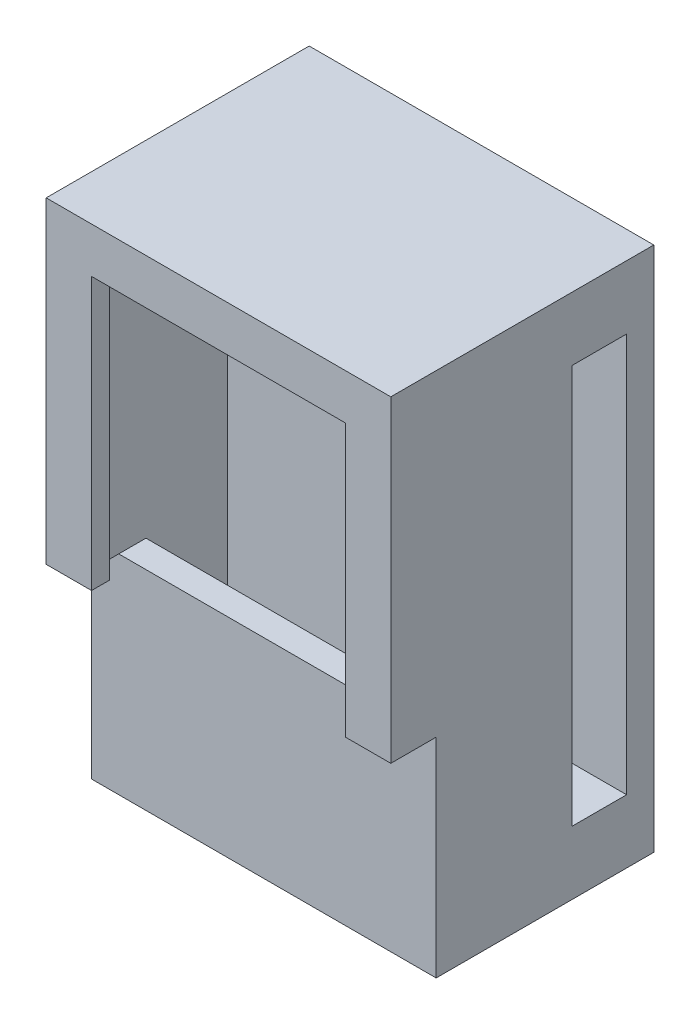
ISO-10303-21;
HEADER;
FILE_DESCRIPTION(('STEP AP214'),'2;1');
FILE_NAME('part.step','',(''),(''),'','','');
FILE_SCHEMA(('AUTOMOTIVE_DESIGN { 1 0 10303 214 1 1 1 1 }'));
ENDSEC;
DATA;
#1=APPLICATION_CONTEXT('core data for automotive mechanical design processes');
#2=APPLICATION_PROTOCOL_DEFINITION('international standard','automotive_design',2000,#1);
#3=PRODUCT_CONTEXT('',#1,'mechanical');
#4=PRODUCT('Part','Part','',(#3));
#5=PRODUCT_RELATED_PRODUCT_CATEGORY('part','',(#4));
#6=PRODUCT_DEFINITION_FORMATION('','',#4);
#7=PRODUCT_DEFINITION_CONTEXT('part definition',#1,'design');
#8=PRODUCT_DEFINITION('design','',#6,#7);
#9=PRODUCT_DEFINITION_SHAPE('','',#8);
#10=(LENGTH_UNIT() NAMED_UNIT(*) SI_UNIT(.MILLI.,.METRE.));
#11=(NAMED_UNIT(*) PLANE_ANGLE_UNIT() SI_UNIT($,.RADIAN.));
#12=(NAMED_UNIT(*) SI_UNIT($,.STERADIAN.) SOLID_ANGLE_UNIT());
#13=UNCERTAINTY_MEASURE_WITH_UNIT(LENGTH_MEASURE(1.E-05),#10,'distance_accuracy_value','');
#14=(GEOMETRIC_REPRESENTATION_CONTEXT(3) GLOBAL_UNCERTAINTY_ASSIGNED_CONTEXT((#13)) GLOBAL_UNIT_ASSIGNED_CONTEXT((#10,
#11,#12)) REPRESENTATION_CONTEXT('',''));
#15=CARTESIAN_POINT('',(0.,0.,0.));
#16=DIRECTION('',(0.,0.,1.));
#17=DIRECTION('',(1.,0.,0.));
#18=AXIS2_PLACEMENT_3D('',#15,#16,#17);
#19=CARTESIAN_POINT('',(0.,0.,6.));
#20=DIRECTION('',(0.,0.,1.));
#21=DIRECTION('',(1.,0.,0.));
#22=AXIS2_PLACEMENT_3D('',#19,#20,#21);
#23=PLANE('',#22);
#24=DIRECTION('',(1.,0.,0.));
#25=VECTOR('',#24,1.);
#26=CARTESIAN_POINT('',(-14.2230185229855,18.9397590361446,6.));
#27=LINE('',#26,#25);
#28=CARTESIAN_POINT('',(-30.2230185229855,18.9397590361446,6.));
#29=VERTEX_POINT('',#28);
#30=CARTESIAN_POINT('',(-14.2230185229855,18.9397590361446,6.));
#31=VERTEX_POINT('',#30);
#32=EDGE_CURVE('E290',#29,#31,#27,.T.);
#33=ORIENTED_EDGE('',*,*,#32,.F.);
#34=DIRECTION('',(0.,1.,0.));
#35=VECTOR('',#34,1.);
#36=CARTESIAN_POINT('',(-30.2230185229855,2.93975903614458,6.));
#37=LINE('',#36,#35);
#38=CARTESIAN_POINT('',(-30.2230185229855,-7.06024096385542,6.));
#39=VERTEX_POINT('',#38);
#40=EDGE_CURVE('E375',#39,#29,#37,.T.);
#41=ORIENTED_EDGE('',*,*,#40,.F.);
#42=DIRECTION('',(-1.,0.,0.));
#43=VECTOR('',#42,1.);
#44=CARTESIAN_POINT('',(-30.2230185229855,-7.06024096385542,6.));
#45=LINE('',#44,#43);
#46=CARTESIAN_POINT('',(-27.2230185229855,-7.06024096385542,6.));
#47=VERTEX_POINT('',#46);
#48=EDGE_CURVE('E384',#47,#39,#45,.T.);
#49=ORIENTED_EDGE('',*,*,#48,.F.);
#50=DIRECTION('',(0.,-1.,0.));
#51=VECTOR('',#50,1.);
#52=CARTESIAN_POINT('',(-27.2230185229855,0.,6.));
#53=LINE('',#52,#51);
#54=CARTESIAN_POINT('',(-27.2230185229855,-3.56024096385542,6.));
#55=VERTEX_POINT('',#54);
#56=EDGE_CURVE('E351',#55,#47,#53,.T.);
#57=ORIENTED_EDGE('',*,*,#56,.F.);
#58=DIRECTION('',(1.,0.,0.));
#59=VECTOR('',#58,1.);
#60=CARTESIAN_POINT('',(0.,-3.56024096385542,6.));
#61=LINE('',#60,#59);
#62=CARTESIAN_POINT('',(-15.2230185229855,-3.56024096385542,6.));
#63=VERTEX_POINT('',#62);
#64=EDGE_CURVE('E11',#55,#63,#61,.T.);
#65=ORIENTED_EDGE('',*,*,#64,.T.);
#66=DIRECTION('',(0.,1.,0.));
#67=VECTOR('',#66,1.);
#68=CARTESIAN_POINT('',(-15.2230185229855,0.,6.));
#69=LINE('',#68,#67);
#70=CARTESIAN_POINT('',(-15.2230185229855,-7.06024096385542,6.));
#71=VERTEX_POINT('',#70);
#72=EDGE_CURVE('E343',#71,#63,#69,.T.);
#73=ORIENTED_EDGE('',*,*,#72,.F.);
#74=CARTESIAN_POINT('',(-14.2230185229855,-7.06024096385542,6.));
#75=VERTEX_POINT('',#74);
#76=EDGE_CURVE('E385',#75,#71,#45,.T.);
#77=ORIENTED_EDGE('',*,*,#76,.F.);
#78=DIRECTION('',(0.,-1.,0.));
#79=VECTOR('',#78,1.);
#80=CARTESIAN_POINT('',(-14.2230185229855,-7.06024096385542,6.));
#81=LINE('',#80,#79);
#82=EDGE_CURVE('E367',#31,#75,#81,.T.);
#83=ORIENTED_EDGE('',*,*,#82,.F.);
#84=EDGE_LOOP('',(#33,#41,#49,#57,#65,#73,#77,#83));
#85=FACE_BOUND('',#84,.T.);
#86=ADVANCED_FACE('F33',(#85),#23,.T.);
#87=CARTESIAN_POINT('',(-14.2230185229855,2.93975903614458,10.5));
#88=DIRECTION('',(0.,-1.,0.));
#89=DIRECTION('',(0.,0.,-1.));
#90=AXIS2_PLACEMENT_3D('',#87,#88,#89);
#91=PLANE('',#90);
#92=DIRECTION('',(0.,0.,-1.));
#93=VECTOR('',#92,1.);
#94=CARTESIAN_POINT('',(-30.2230185229855,2.93975903614458,13.5));
#95=LINE('',#94,#93);
#96=CARTESIAN_POINT('',(-30.2230185229855,2.93975903614458,12.));
#97=VERTEX_POINT('',#96);
#98=CARTESIAN_POINT('',(-30.2230185229855,2.93975903614458,10.5));
#99=VERTEX_POINT('',#98);
#100=EDGE_CURVE('E300',#97,#99,#95,.T.);
#101=ORIENTED_EDGE('',*,*,#100,.F.);
#102=DIRECTION('',(-1.,0.,0.));
#103=VECTOR('',#102,1.);
#104=CARTESIAN_POINT('',(-31.7230185229855,2.93975903614458,12.));
#105=LINE('',#104,#103);
#106=CARTESIAN_POINT('',(-14.2230185229855,2.93975903614458,12.));
#107=VERTEX_POINT('',#106);
#108=EDGE_CURVE('E368',#107,#97,#105,.T.);
#109=ORIENTED_EDGE('',*,*,#108,.F.);
#110=DIRECTION('',(0.,0.,-1.));
#111=VECTOR('',#110,1.);
#112=CARTESIAN_POINT('',(-14.2230185229855,2.93975903614458,13.5));
#113=LINE('',#112,#111);
#114=CARTESIAN_POINT('',(-14.2230185229855,2.93975903614458,10.5));
#115=VERTEX_POINT('',#114);
#116=EDGE_CURVE('E311',#107,#115,#113,.T.);
#117=ORIENTED_EDGE('',*,*,#116,.T.);
#118=DIRECTION('',(-1.,0.,0.));
#119=VECTOR('',#118,1.);
#120=CARTESIAN_POINT('',(-31.7230185229855,2.93975903614458,10.5));
#121=LINE('',#120,#119);
#122=EDGE_CURVE('E353',#115,#99,#121,.T.);
#123=ORIENTED_EDGE('',*,*,#122,.T.);
#124=EDGE_LOOP('',(#101,#109,#117,#123));
#125=FACE_BOUND('',#124,.T.);
#126=ADVANCED_FACE('F491',(#125),#91,.F.);
#127=CARTESIAN_POINT('',(-31.7230185229855,20.4397590361446,6.));
#128=DIRECTION('',(1.,0.,0.));
#129=DIRECTION('',(0.,0.,-1.));
#130=AXIS2_PLACEMENT_3D('',#127,#128,#129);
#131=PLANE('',#130);
#132=DIRECTION('',(0.,0.,1.));
#133=VECTOR('',#132,1.);
#134=CARTESIAN_POINT('',(-31.7230185229855,16.9397590361446,4.5));
#135=LINE('',#134,#133);
#136=CARTESIAN_POINT('',(-31.7230185229855,16.9397590361446,1.5));
#137=VERTEX_POINT('',#136);
#138=CARTESIAN_POINT('',(-31.7230185229855,16.9397590361446,4.5));
#139=VERTEX_POINT('',#138);
#140=EDGE_CURVE('E220',#137,#139,#135,.T.);
#141=ORIENTED_EDGE('',*,*,#140,.T.);
#142=DIRECTION('',(0.,-1.,0.));
#143=VECTOR('',#142,1.);
#144=CARTESIAN_POINT('',(-31.7230185229855,-5.06024096385542,4.5));
#145=LINE('',#144,#143);
#146=CARTESIAN_POINT('',(-31.7230185229855,-5.06024096385542,4.5));
#147=VERTEX_POINT('',#146);
#148=EDGE_CURVE('E214',#139,#147,#145,.T.);
#149=ORIENTED_EDGE('',*,*,#148,.T.);
#150=DIRECTION('',(0.,0.,-1.));
#151=VECTOR('',#150,1.);
#152=CARTESIAN_POINT('',(-31.7230185229855,-5.06024096385542,4.5));
#153=LINE('',#152,#151);
#154=CARTESIAN_POINT('',(-31.7230185229855,-5.06024096385542,1.5));
#155=VERTEX_POINT('',#154);
#156=EDGE_CURVE('E223',#147,#155,#153,.T.);
#157=ORIENTED_EDGE('',*,*,#156,.T.);
#158=DIRECTION('',(0.,1.,0.));
#159=VECTOR('',#158,1.);
#160=CARTESIAN_POINT('',(-31.7230185229855,-5.06024096385542,1.5));
#161=LINE('',#160,#159);
#162=EDGE_CURVE('E48',#155,#137,#161,.T.);
#163=ORIENTED_EDGE('',*,*,#162,.T.);
#164=EDGE_LOOP('',(#141,#149,#157,#163));
#165=FACE_BOUND('',#164,.T.);
#166=DIRECTION('',(0.,-1.,0.));
#167=VECTOR('',#166,1.);
#168=CARTESIAN_POINT('',(-31.7230185229855,20.4397590361446,0.));
#169=LINE('',#168,#167);
#170=CARTESIAN_POINT('',(-31.7230185229855,20.4397590361446,0.));
#171=VERTEX_POINT('',#170);
#172=CARTESIAN_POINT('',(-31.7230185229855,-8.56024096385542,0.));
#173=VERTEX_POINT('',#172);
#174=EDGE_CURVE('E394',#171,#173,#169,.T.);
#175=ORIENTED_EDGE('',*,*,#174,.T.);
#176=DIRECTION('',(0.,0.,-1.));
#177=VECTOR('',#176,1.);
#178=CARTESIAN_POINT('',(-31.7230185229855,-8.56024096385542,6.));
#179=LINE('',#178,#177);
#180=CARTESIAN_POINT('',(-31.7230185229855,-8.56024096385542,12.));
#181=VERTEX_POINT('',#180);
#182=EDGE_CURVE('E412',#181,#173,#179,.T.);
#183=ORIENTED_EDGE('',*,*,#182,.F.);
#184=DIRECTION('',(0.,-1.,0.));
#185=VECTOR('',#184,1.);
#186=CARTESIAN_POINT('',(-31.7230185229855,2.93975903614458,12.));
#187=LINE('',#186,#185);
#188=CARTESIAN_POINT('',(-31.7230185229855,2.93975903614458,12.));
#189=VERTEX_POINT('',#188);
#190=EDGE_CURVE('E354',#189,#181,#187,.T.);
#191=ORIENTED_EDGE('',*,*,#190,.F.);
#192=DIRECTION('',(0.,0.,-1.));
#193=VECTOR('',#192,1.);
#194=CARTESIAN_POINT('',(-31.7230185229855,2.93975903614458,13.5));
#195=LINE('',#194,#193);
#196=CARTESIAN_POINT('',(-31.7230185229855,2.93975903614458,14.5));
#197=VERTEX_POINT('',#196);
#198=EDGE_CURVE('E306',#197,#189,#195,.T.);
#199=ORIENTED_EDGE('',*,*,#198,.F.);
#200=DIRECTION('',(0.,-1.,0.));
#201=VECTOR('',#200,1.);
#202=CARTESIAN_POINT('',(-31.7230185229855,2.93975903614458,14.5));
#203=LINE('',#202,#201);
#204=CARTESIAN_POINT('',(-31.7230185229855,20.4397590361446,14.5));
#205=VERTEX_POINT('',#204);
#206=EDGE_CURVE('E255',#205,#197,#203,.T.);
#207=ORIENTED_EDGE('',*,*,#206,.F.);
#208=DIRECTION('',(0.,0.,-1.));
#209=VECTOR('',#208,1.);
#210=CARTESIAN_POINT('',(-31.7230185229855,20.4397590361446,6.));
#211=LINE('',#210,#209);
#212=EDGE_CURVE('E403',#205,#171,#211,.T.);
#213=ORIENTED_EDGE('',*,*,#212,.T.);
#214=EDGE_LOOP('',(#175,#183,#191,#199,#207,#213));
#215=FACE_BOUND('',#214,.T.);
#216=ADVANCED_FACE('F35',(#165,#215),#131,.F.);
#217=CARTESIAN_POINT('',(-31.7230185229855,-8.56024096385542,6.));
#218=DIRECTION('',(0.,1.,0.));
#219=DIRECTION('',(-1.,0.,0.));
#220=AXIS2_PLACEMENT_3D('',#217,#218,#219);
#221=PLANE('',#220);
#222=DIRECTION('',(1.,0.,0.));
#223=VECTOR('',#222,1.);
#224=CARTESIAN_POINT('',(-27.2230185229855,-8.56024096385542,5.3));
#225=LINE('',#224,#223);
#226=CARTESIAN_POINT('',(-27.2230185229855,-8.56024096385542,5.3));
#227=VERTEX_POINT('',#226);
#228=CARTESIAN_POINT('',(-15.2230185229855,-8.56024096385542,5.3));
#229=VERTEX_POINT('',#228);
#230=EDGE_CURVE('E333',#227,#229,#225,.T.);
#231=ORIENTED_EDGE('',*,*,#230,.F.);
#232=DIRECTION('',(0.,0.,-1.));
#233=VECTOR('',#232,1.);
#234=CARTESIAN_POINT('',(-27.2230185229855,-8.56024096385542,9.3));
#235=LINE('',#234,#233);
#236=CARTESIAN_POINT('',(-27.2230185229855,-8.56024096385542,9.3));
#237=VERTEX_POINT('',#236);
#238=EDGE_CURVE('E321',#237,#227,#235,.T.);
#239=ORIENTED_EDGE('',*,*,#238,.F.);
#240=DIRECTION('',(-1.,0.,0.));
#241=VECTOR('',#240,1.);
#242=CARTESIAN_POINT('',(-27.2230185229855,-8.56024096385542,9.3));
#243=LINE('',#242,#241);
#244=CARTESIAN_POINT('',(-15.2230185229855,-8.56024096385542,9.3));
#245=VERTEX_POINT('',#244);
#246=EDGE_CURVE('E325',#245,#237,#243,.T.);
#247=ORIENTED_EDGE('',*,*,#246,.F.);
#248=DIRECTION('',(0.,0.,1.));
#249=VECTOR('',#248,1.);
#250=CARTESIAN_POINT('',(-15.2230185229855,-8.56024096385542,9.3));
#251=LINE('',#250,#249);
#252=EDGE_CURVE('E336',#229,#245,#251,.T.);
#253=ORIENTED_EDGE('',*,*,#252,.F.);
#254=EDGE_LOOP('',(#231,#239,#247,#253));
#255=FACE_BOUND('',#254,.T.);
#256=DIRECTION('',(1.,0.,0.));
#257=VECTOR('',#256,1.);
#258=CARTESIAN_POINT('',(-31.7230185229855,-8.56024096385542,0.));
#259=LINE('',#258,#257);
#260=CARTESIAN_POINT('',(-12.7230185229855,-8.56024096385542,0.));
#261=VERTEX_POINT('',#260);
#262=EDGE_CURVE('E397',#173,#261,#259,.T.);
#263=ORIENTED_EDGE('',*,*,#262,.T.);
#264=DIRECTION('',(0.,0.,-1.));
#265=VECTOR('',#264,1.);
#266=CARTESIAN_POINT('',(-12.7230185229855,-8.56024096385542,6.));
#267=LINE('',#266,#265);
#268=CARTESIAN_POINT('',(-12.7230185229855,-8.56024096385542,12.));
#269=VERTEX_POINT('',#268);
#270=EDGE_CURVE('E409',#269,#261,#267,.T.);
#271=ORIENTED_EDGE('',*,*,#270,.F.);
#272=DIRECTION('',(1.,0.,0.));
#273=VECTOR('',#272,1.);
#274=CARTESIAN_POINT('',(-31.7230185229855,-8.56024096385542,12.));
#275=LINE('',#274,#273);
#276=EDGE_CURVE('E357',#181,#269,#275,.T.);
#277=ORIENTED_EDGE('',*,*,#276,.F.);
#278=ORIENTED_EDGE('',*,*,#182,.T.);
#279=EDGE_LOOP('',(#263,#271,#277,#278));
#280=FACE_BOUND('',#279,.T.);
#281=ADVANCED_FACE('F474',(#255,#280),#221,.F.);
#282=CARTESIAN_POINT('',(-12.7230185229855,20.4397590361446,6.));
#283=DIRECTION('',(-1.,0.,0.));
#284=DIRECTION('',(0.,0.,1.));
#285=AXIS2_PLACEMENT_3D('',#282,#283,#284);
#286=PLANE('',#285);
#287=DIRECTION('',(0.,0.,-1.));
#288=VECTOR('',#287,1.);
#289=CARTESIAN_POINT('',(-12.7230185229855,-5.06024096385542,4.5));
#290=LINE('',#289,#288);
#291=CARTESIAN_POINT('',(-12.7230185229855,-5.06024096385542,4.5));
#292=VERTEX_POINT('',#291);
#293=CARTESIAN_POINT('',(-12.7230185229855,-5.06024096385542,1.5));
#294=VERTEX_POINT('',#293);
#295=EDGE_CURVE('E238',#292,#294,#290,.T.);
#296=ORIENTED_EDGE('',*,*,#295,.F.);
#297=DIRECTION('',(0.,-1.,0.));
#298=VECTOR('',#297,1.);
#299=CARTESIAN_POINT('',(-12.7230185229855,-5.06024096385542,4.5));
#300=LINE('',#299,#298);
#301=CARTESIAN_POINT('',(-12.7230185229855,16.9397590361446,4.5));
#302=VERTEX_POINT('',#301);
#303=EDGE_CURVE('E56',#302,#292,#300,.T.);
#304=ORIENTED_EDGE('',*,*,#303,.F.);
#305=DIRECTION('',(0.,0.,1.));
#306=VECTOR('',#305,1.);
#307=CARTESIAN_POINT('',(-12.7230185229855,16.9397590361446,4.5));
#308=LINE('',#307,#306);
#309=CARTESIAN_POINT('',(-12.7230185229855,16.9397590361446,1.5));
#310=VERTEX_POINT('',#309);
#311=EDGE_CURVE('E229',#310,#302,#308,.T.);
#312=ORIENTED_EDGE('',*,*,#311,.F.);
#313=DIRECTION('',(0.,1.,0.));
#314=VECTOR('',#313,1.);
#315=CARTESIAN_POINT('',(-12.7230185229855,-5.06024096385542,1.5));
#316=LINE('',#315,#314);
#317=EDGE_CURVE('E232',#294,#310,#316,.T.);
#318=ORIENTED_EDGE('',*,*,#317,.F.);
#319=EDGE_LOOP('',(#296,#304,#312,#318));
#320=FACE_BOUND('',#319,.T.);
#321=DIRECTION('',(0.,0.,-1.));
#322=VECTOR('',#321,1.);
#323=CARTESIAN_POINT('',(-12.7230185229855,20.4397590361446,6.));
#324=LINE('',#323,#322);
#325=CARTESIAN_POINT('',(-12.7230185229855,20.4397590361446,14.5));
#326=VERTEX_POINT('',#325);
#327=CARTESIAN_POINT('',(-12.7230185229855,20.4397590361446,0.));
#328=VERTEX_POINT('',#327);
#329=EDGE_CURVE('E406',#326,#328,#324,.T.);
#330=ORIENTED_EDGE('',*,*,#329,.F.);
#331=DIRECTION('',(0.,1.,0.));
#332=VECTOR('',#331,1.);
#333=CARTESIAN_POINT('',(-12.7230185229855,20.4397590361446,14.5));
#334=LINE('',#333,#332);
#335=CARTESIAN_POINT('',(-12.7230185229855,2.93975903614458,14.5));
#336=VERTEX_POINT('',#335);
#337=EDGE_CURVE('E248',#336,#326,#334,.T.);
#338=ORIENTED_EDGE('',*,*,#337,.F.);
#339=DIRECTION('',(0.,0.,-1.));
#340=VECTOR('',#339,1.);
#341=CARTESIAN_POINT('',(-12.7230185229855,2.93975903614458,13.5));
#342=LINE('',#341,#340);
#343=CARTESIAN_POINT('',(-12.7230185229855,2.93975903614458,12.));
#344=VERTEX_POINT('',#343);
#345=EDGE_CURVE('E308',#336,#344,#342,.T.);
#346=ORIENTED_EDGE('',*,*,#345,.T.);
#347=DIRECTION('',(0.,1.,0.));
#348=VECTOR('',#347,1.);
#349=CARTESIAN_POINT('',(-12.7230185229855,2.93975903614458,12.));
#350=LINE('',#349,#348);
#351=EDGE_CURVE('E360',#269,#344,#350,.T.);
#352=ORIENTED_EDGE('',*,*,#351,.F.);
#353=ORIENTED_EDGE('',*,*,#270,.T.);
#354=DIRECTION('',(0.,1.,0.));
#355=VECTOR('',#354,1.);
#356=CARTESIAN_POINT('',(-12.7230185229855,20.4397590361446,0.));
#357=LINE('',#356,#355);
#358=EDGE_CURVE('E399',#261,#328,#357,.T.);
#359=ORIENTED_EDGE('',*,*,#358,.T.);
#360=EDGE_LOOP('',(#330,#338,#346,#352,#353,#359));
#361=FACE_BOUND('',#360,.T.);
#362=ADVANCED_FACE('F477',(#320,#361),#286,.F.);
#363=CARTESIAN_POINT('',(-31.7230185229855,20.4397590361446,6.));
#364=DIRECTION('',(0.,-1.,0.));
#365=DIRECTION('',(0.,0.,-1.));
#366=AXIS2_PLACEMENT_3D('',#363,#364,#365);
#367=PLANE('',#366);
#368=DIRECTION('',(-1.,0.,0.));
#369=VECTOR('',#368,1.);
#370=CARTESIAN_POINT('',(-31.7230185229855,20.4397590361446,0.));
#371=LINE('',#370,#369);
#372=EDGE_CURVE('E401',#328,#171,#371,.T.);
#373=ORIENTED_EDGE('',*,*,#372,.T.);
#374=ORIENTED_EDGE('',*,*,#212,.F.);
#375=DIRECTION('',(-1.,0.,0.));
#376=VECTOR('',#375,1.);
#377=CARTESIAN_POINT('',(-31.7230185229855,20.4397590361446,14.5));
#378=LINE('',#377,#376);
#379=EDGE_CURVE('E251',#326,#205,#378,.T.);
#380=ORIENTED_EDGE('',*,*,#379,.F.);
#381=ORIENTED_EDGE('',*,*,#329,.T.);
#382=EDGE_LOOP('',(#373,#374,#380,#381));
#383=FACE_BOUND('',#382,.T.);
#384=ADVANCED_FACE('F505',(#383),#367,.F.);
#385=CARTESIAN_POINT('',(0.,0.,0.));
#386=DIRECTION('',(0.,0.,1.));
#387=DIRECTION('',(1.,0.,0.));
#388=AXIS2_PLACEMENT_3D('',#385,#386,#387);
#389=PLANE('',#388);
#390=ORIENTED_EDGE('',*,*,#174,.F.);
#391=ORIENTED_EDGE('',*,*,#372,.F.);
#392=ORIENTED_EDGE('',*,*,#358,.F.);
#393=ORIENTED_EDGE('',*,*,#262,.F.);
#394=EDGE_LOOP('',(#390,#391,#392,#393));
#395=FACE_BOUND('',#394,.T.);
#396=ADVANCED_FACE('F502',(#395),#389,.F.);
#397=CARTESIAN_POINT('',(-14.2230185229855,-7.06024096385542,10.5));
#398=DIRECTION('',(1.,0.,0.));
#399=DIRECTION('',(0.,0.,-1.));
#400=AXIS2_PLACEMENT_3D('',#397,#398,#399);
#401=PLANE('',#400);
#402=ORIENTED_EDGE('',*,*,#82,.T.);
#403=DIRECTION('',(0.,0.,-1.));
#404=VECTOR('',#403,1.);
#405=CARTESIAN_POINT('',(-14.2230185229855,-7.06024096385542,10.5));
#406=LINE('',#405,#404);
#407=CARTESIAN_POINT('',(-14.2230185229855,-7.06024096385542,10.5));
#408=VERTEX_POINT('',#407);
#409=EDGE_CURVE('E391',#408,#75,#406,.T.);
#410=ORIENTED_EDGE('',*,*,#409,.F.);
#411=DIRECTION('',(0.,-1.,0.));
#412=VECTOR('',#411,1.);
#413=CARTESIAN_POINT('',(-14.2230185229855,-7.06024096385542,10.5));
#414=LINE('',#413,#412);
#415=EDGE_CURVE('E371',#115,#408,#414,.T.);
#416=ORIENTED_EDGE('',*,*,#415,.F.);
#417=ORIENTED_EDGE('',*,*,#116,.F.);
#418=CARTESIAN_POINT('',(-14.2230185229855,2.93975903614458,13.5));
#419=VERTEX_POINT('',#418);
#420=EDGE_CURVE('E312',#419,#107,#113,.T.);
#421=ORIENTED_EDGE('',*,*,#420,.F.);
#422=DIRECTION('',(0.,-1.,0.));
#423=VECTOR('',#422,1.);
#424=CARTESIAN_POINT('',(-14.2230185229855,2.93975903614458,13.5));
#425=LINE('',#424,#423);
#426=CARTESIAN_POINT('',(-14.2230185229855,18.9397590361446,13.5));
#427=VERTEX_POINT('',#426);
#428=EDGE_CURVE('E297',#427,#419,#425,.T.);
#429=ORIENTED_EDGE('',*,*,#428,.F.);
#430=DIRECTION('',(0.,0.,-1.));
#431=VECTOR('',#430,1.);
#432=CARTESIAN_POINT('',(-14.2230185229855,18.9397590361446,13.5));
#433=LINE('',#432,#431);
#434=EDGE_CURVE('E315',#427,#31,#433,.T.);
#435=ORIENTED_EDGE('',*,*,#434,.T.);
#436=EDGE_LOOP('',(#402,#410,#416,#417,#421,#429,#435));
#437=FACE_BOUND('',#436,.T.);
#438=ADVANCED_FACE('F441',(#437),#401,.F.);
#439=CARTESIAN_POINT('',(-30.2230185229855,-7.06024096385542,10.5));
#440=DIRECTION('',(0.,-1.,0.));
#441=DIRECTION('',(0.,0.,-1.));
#442=AXIS2_PLACEMENT_3D('',#439,#440,#441);
#443=PLANE('',#442);
#444=DIRECTION('',(-1.,0.,0.));
#445=VECTOR('',#444,1.);
#446=CARTESIAN_POINT('',(-30.2230185229855,-7.06024096385542,9.3));
#447=LINE('',#446,#445);
#448=CARTESIAN_POINT('',(-15.2230185229855,-7.06024096385542,9.3));
#449=VERTEX_POINT('',#448);
#450=CARTESIAN_POINT('',(-27.2230185229855,-7.06024096385542,9.3));
#451=VERTEX_POINT('',#450);
#452=EDGE_CURVE('E418',#449,#451,#447,.T.);
#453=ORIENTED_EDGE('',*,*,#452,.T.);
#454=DIRECTION('',(0.,0.,-1.));
#455=VECTOR('',#454,1.);
#456=CARTESIAN_POINT('',(-27.2230185229855,-7.06024096385542,10.5));
#457=LINE('',#456,#455);
#458=EDGE_CURVE('E41',#451,#47,#457,.T.);
#459=ORIENTED_EDGE('',*,*,#458,.T.);
#460=ORIENTED_EDGE('',*,*,#48,.T.);
#461=DIRECTION('',(0.,0.,-1.));
#462=VECTOR('',#461,1.);
#463=CARTESIAN_POINT('',(-30.2230185229855,-7.06024096385542,10.5));
#464=LINE('',#463,#462);
#465=CARTESIAN_POINT('',(-30.2230185229855,-7.06024096385542,10.5));
#466=VERTEX_POINT('',#465);
#467=EDGE_CURVE('E381',#466,#39,#464,.T.);
#468=ORIENTED_EDGE('',*,*,#467,.F.);
#469=DIRECTION('',(-1.,0.,0.));
#470=VECTOR('',#469,1.);
#471=CARTESIAN_POINT('',(-30.2230185229855,-7.06024096385542,10.5));
#472=LINE('',#471,#470);
#473=EDGE_CURVE('E374',#408,#466,#472,.T.);
#474=ORIENTED_EDGE('',*,*,#473,.F.);
#475=ORIENTED_EDGE('',*,*,#409,.T.);
#476=ORIENTED_EDGE('',*,*,#76,.T.);
#477=DIRECTION('',(0.,0.,1.));
#478=VECTOR('',#477,1.);
#479=CARTESIAN_POINT('',(-15.2230185229855,-7.06024096385542,10.5));
#480=LINE('',#479,#478);
#481=EDGE_CURVE('E415',#71,#449,#480,.T.);
#482=ORIENTED_EDGE('',*,*,#481,.T.);
#483=EDGE_LOOP('',(#453,#459,#460,#468,#474,#475,#476,#482));
#484=FACE_BOUND('',#483,.T.);
#485=ADVANCED_FACE('F423',(#484),#443,.F.);
#486=CARTESIAN_POINT('',(-30.2230185229855,2.93975903614458,10.5));
#487=DIRECTION('',(-1.,0.,0.));
#488=DIRECTION('',(0.,0.,1.));
#489=AXIS2_PLACEMENT_3D('',#486,#487,#488);
#490=PLANE('',#489);
#491=ORIENTED_EDGE('',*,*,#40,.T.);
#492=DIRECTION('',(0.,0.,-1.));
#493=VECTOR('',#492,1.);
#494=CARTESIAN_POINT('',(-30.2230185229855,18.9397590361446,13.5));
#495=LINE('',#494,#493);
#496=CARTESIAN_POINT('',(-30.2230185229855,18.9397590361446,13.5));
#497=VERTEX_POINT('',#496);
#498=EDGE_CURVE('E318',#497,#29,#495,.T.);
#499=ORIENTED_EDGE('',*,*,#498,.F.);
#500=DIRECTION('',(0.,1.,0.));
#501=VECTOR('',#500,1.);
#502=CARTESIAN_POINT('',(-30.2230185229855,18.9397590361446,13.5));
#503=LINE('',#502,#501);
#504=CARTESIAN_POINT('',(-30.2230185229855,2.93975903614458,13.5));
#505=VERTEX_POINT('',#504);
#506=EDGE_CURVE('E291',#505,#497,#503,.T.);
#507=ORIENTED_EDGE('',*,*,#506,.F.);
#508=EDGE_CURVE('E303',#505,#97,#95,.T.);
#509=ORIENTED_EDGE('',*,*,#508,.T.);
#510=ORIENTED_EDGE('',*,*,#100,.T.);
#511=DIRECTION('',(0.,1.,0.));
#512=VECTOR('',#511,1.);
#513=CARTESIAN_POINT('',(-30.2230185229855,2.93975903614458,10.5));
#514=LINE('',#513,#512);
#515=EDGE_CURVE('E378',#466,#99,#514,.T.);
#516=ORIENTED_EDGE('',*,*,#515,.F.);
#517=ORIENTED_EDGE('',*,*,#467,.T.);
#518=EDGE_LOOP('',(#491,#499,#507,#509,#510,#516,#517));
#519=FACE_BOUND('',#518,.T.);
#520=ADVANCED_FACE('F434',(#519),#490,.F.);
#521=CARTESIAN_POINT('',(0.,0.,10.5));
#522=DIRECTION('',(0.,0.,1.));
#523=DIRECTION('',(1.,0.,0.));
#524=AXIS2_PLACEMENT_3D('',#521,#522,#523);
#525=PLANE('',#524);
#526=ORIENTED_EDGE('',*,*,#122,.F.);
#527=ORIENTED_EDGE('',*,*,#415,.T.);
#528=ORIENTED_EDGE('',*,*,#473,.T.);
#529=ORIENTED_EDGE('',*,*,#515,.T.);
#530=EDGE_LOOP('',(#526,#527,#528,#529));
#531=FACE_BOUND('',#530,.T.);
#532=ADVANCED_FACE('F439',(#531),#525,.F.);
#533=CARTESIAN_POINT('',(0.,0.,12.));
#534=DIRECTION('',(0.,0.,1.));
#535=DIRECTION('',(1.,0.,0.));
#536=AXIS2_PLACEMENT_3D('',#533,#534,#535);
#537=PLANE('',#536);
#538=ORIENTED_EDGE('',*,*,#190,.T.);
#539=ORIENTED_EDGE('',*,*,#276,.T.);
#540=ORIENTED_EDGE('',*,*,#351,.T.);
#541=EDGE_CURVE('E364',#344,#107,#105,.T.);
#542=ORIENTED_EDGE('',*,*,#541,.T.);
#543=ORIENTED_EDGE('',*,*,#108,.T.);
#544=EDGE_CURVE('E363',#97,#189,#105,.T.);
#545=ORIENTED_EDGE('',*,*,#544,.T.);
#546=EDGE_LOOP('',(#538,#539,#540,#542,#543,#545));
#547=FACE_BOUND('',#546,.T.);
#548=ADVANCED_FACE('F469',(#547),#537,.T.);
#549=CARTESIAN_POINT('',(-27.2230185229855,-3.56024096385542,9.3));
#550=DIRECTION('',(0.,0.,1.));
#551=DIRECTION('',(1.,0.,0.));
#552=AXIS2_PLACEMENT_3D('',#549,#550,#551);
#553=PLANE('',#552);
#554=DIRECTION('',(0.,-1.,0.));
#555=VECTOR('',#554,1.);
#556=CARTESIAN_POINT('',(-15.2230185229855,-3.56024096385542,9.3));
#557=LINE('',#556,#555);
#558=EDGE_CURVE('E344',#449,#245,#557,.T.);
#559=ORIENTED_EDGE('',*,*,#558,.T.);
#560=ORIENTED_EDGE('',*,*,#246,.T.);
#561=DIRECTION('',(0.,-1.,0.));
#562=VECTOR('',#561,1.);
#563=CARTESIAN_POINT('',(-27.2230185229855,-3.56024096385542,9.3));
#564=LINE('',#563,#562);
#565=EDGE_CURVE('E341',#451,#237,#564,.T.);
#566=ORIENTED_EDGE('',*,*,#565,.F.);
#567=ORIENTED_EDGE('',*,*,#452,.F.);
#568=EDGE_LOOP('',(#559,#560,#566,#567));
#569=FACE_BOUND('',#568,.T.);
#570=ADVANCED_FACE('F528',(#569),#553,.F.);
#571=CARTESIAN_POINT('',(-27.2230185229855,-3.56024096385542,9.3));
#572=DIRECTION('',(-1.,0.,0.));
#573=DIRECTION('',(0.,-1.,0.));
#574=AXIS2_PLACEMENT_3D('',#571,#572,#573);
#575=PLANE('',#574);
#576=ORIENTED_EDGE('',*,*,#56,.T.);
#577=ORIENTED_EDGE('',*,*,#458,.F.);
#578=ORIENTED_EDGE('',*,*,#565,.T.);
#579=ORIENTED_EDGE('',*,*,#238,.T.);
#580=DIRECTION('',(0.,-1.,0.));
#581=VECTOR('',#580,1.);
#582=CARTESIAN_POINT('',(-27.2230185229855,-3.56024096385542,5.3));
#583=LINE('',#582,#581);
#584=CARTESIAN_POINT('',(-27.2230185229855,-3.56024096385542,5.3));
#585=VERTEX_POINT('',#584);
#586=EDGE_CURVE('E331',#585,#227,#583,.T.);
#587=ORIENTED_EDGE('',*,*,#586,.F.);
#588=DIRECTION('',(0.,0.,-1.));
#589=VECTOR('',#588,1.);
#590=CARTESIAN_POINT('',(-27.2230185229855,-3.56024096385542,9.3));
#591=LINE('',#590,#589);
#592=EDGE_CURVE('E322',#55,#585,#591,.T.);
#593=ORIENTED_EDGE('',*,*,#592,.F.);
#594=EDGE_LOOP('',(#576,#577,#578,#579,#587,#593));
#595=FACE_BOUND('',#594,.T.);
#596=ADVANCED_FACE('F526',(#595),#575,.F.);
#597=CARTESIAN_POINT('',(-15.2230185229855,-3.56024096385542,9.3));
#598=DIRECTION('',(1.,0.,0.));
#599=DIRECTION('',(0.,1.,0.));
#600=AXIS2_PLACEMENT_3D('',#597,#598,#599);
#601=PLANE('',#600);
#602=ORIENTED_EDGE('',*,*,#72,.T.);
#603=DIRECTION('',(0.,0.,1.));
#604=VECTOR('',#603,1.);
#605=CARTESIAN_POINT('',(-15.2230185229855,-3.56024096385542,9.3));
#606=LINE('',#605,#604);
#607=CARTESIAN_POINT('',(-15.2230185229855,-3.56024096385542,5.3));
#608=VERTEX_POINT('',#607);
#609=EDGE_CURVE('E328',#608,#63,#606,.T.);
#610=ORIENTED_EDGE('',*,*,#609,.F.);
#611=DIRECTION('',(0.,-1.,0.));
#612=VECTOR('',#611,1.);
#613=CARTESIAN_POINT('',(-15.2230185229855,-3.56024096385542,5.3));
#614=LINE('',#613,#612);
#615=EDGE_CURVE('E346',#608,#229,#614,.T.);
#616=ORIENTED_EDGE('',*,*,#615,.T.);
#617=ORIENTED_EDGE('',*,*,#252,.T.);
#618=ORIENTED_EDGE('',*,*,#558,.F.);
#619=ORIENTED_EDGE('',*,*,#481,.F.);
#620=EDGE_LOOP('',(#602,#610,#616,#617,#618,#619));
#621=FACE_BOUND('',#620,.T.);
#622=ADVANCED_FACE('F530',(#621),#601,.F.);
#623=CARTESIAN_POINT('',(-27.2230185229855,-3.56024096385542,5.3));
#624=DIRECTION('',(0.,0.,-1.));
#625=DIRECTION('',(-1.,0.,0.));
#626=AXIS2_PLACEMENT_3D('',#623,#624,#625);
#627=PLANE('',#626);
#628=ORIENTED_EDGE('',*,*,#230,.T.);
#629=ORIENTED_EDGE('',*,*,#615,.F.);
#630=DIRECTION('',(1.,0.,0.));
#631=VECTOR('',#630,1.);
#632=CARTESIAN_POINT('',(-27.2230185229855,-3.56024096385542,5.3));
#633=LINE('',#632,#631);
#634=EDGE_CURVE('E324',#585,#608,#633,.T.);
#635=ORIENTED_EDGE('',*,*,#634,.F.);
#636=ORIENTED_EDGE('',*,*,#586,.T.);
#637=EDGE_LOOP('',(#628,#629,#635,#636));
#638=FACE_BOUND('',#637,.T.);
#639=ADVANCED_FACE('F521',(#638),#627,.F.);
#640=CARTESIAN_POINT('',(0.,-3.56024096385542,0.));
#641=DIRECTION('',(0.,-1.,0.));
#642=DIRECTION('',(1.,0.,0.));
#643=AXIS2_PLACEMENT_3D('',#640,#641,#642);
#644=PLANE('',#643);
#645=ORIENTED_EDGE('',*,*,#592,.T.);
#646=ORIENTED_EDGE('',*,*,#634,.T.);
#647=ORIENTED_EDGE('',*,*,#609,.T.);
#648=ORIENTED_EDGE('',*,*,#64,.F.);
#649=EDGE_LOOP('',(#645,#646,#647,#648));
#650=FACE_BOUND('',#649,.T.);
#651=ADVANCED_FACE('F532',(#650),#644,.T.);
#652=CARTESIAN_POINT('',(-14.2230185229855,18.9397590361446,13.5));
#653=DIRECTION('',(0.,1.,0.));
#654=DIRECTION('',(-1.,0.,0.));
#655=AXIS2_PLACEMENT_3D('',#652,#653,#654);
#656=PLANE('',#655);
#657=ORIENTED_EDGE('',*,*,#32,.T.);
#658=ORIENTED_EDGE('',*,*,#434,.F.);
#659=DIRECTION('',(1.,0.,0.));
#660=VECTOR('',#659,1.);
#661=CARTESIAN_POINT('',(-14.2230185229855,18.9397590361446,13.5));
#662=LINE('',#661,#660);
#663=EDGE_CURVE('E294',#497,#427,#662,.T.);
#664=ORIENTED_EDGE('',*,*,#663,.F.);
#665=ORIENTED_EDGE('',*,*,#498,.T.);
#666=EDGE_LOOP('',(#657,#658,#664,#665));
#667=FACE_BOUND('',#666,.T.);
#668=ADVANCED_FACE('F445',(#667),#656,.F.);
#669=CARTESIAN_POINT('',(-12.7230185229855,2.93975903614458,13.5));
#670=DIRECTION('',(0.,1.,0.));
#671=DIRECTION('',(0.,0.,1.));
#672=AXIS2_PLACEMENT_3D('',#669,#670,#671);
#673=PLANE('',#672);
#674=ORIENTED_EDGE('',*,*,#541,.F.);
#675=ORIENTED_EDGE('',*,*,#345,.F.);
#676=DIRECTION('',(1.,0.,0.));
#677=VECTOR('',#676,1.);
#678=CARTESIAN_POINT('',(-12.7230185229855,2.93975903614458,14.5));
#679=LINE('',#678,#677);
#680=CARTESIAN_POINT('',(-15.2230185229855,2.93975903614458,14.5));
#681=VERTEX_POINT('',#680);
#682=EDGE_CURVE('E266',#681,#336,#679,.T.);
#683=ORIENTED_EDGE('',*,*,#682,.F.);
#684=DIRECTION('',(0.,0.,-1.));
#685=VECTOR('',#684,1.);
#686=CARTESIAN_POINT('',(-15.2230185229855,2.93975903614458,14.5));
#687=LINE('',#686,#685);
#688=CARTESIAN_POINT('',(-15.2230185229855,2.93975903614458,13.5));
#689=VERTEX_POINT('',#688);
#690=EDGE_CURVE('E269',#681,#689,#687,.T.);
#691=ORIENTED_EDGE('',*,*,#690,.T.);
#692=DIRECTION('',(1.,0.,0.));
#693=VECTOR('',#692,1.);
#694=CARTESIAN_POINT('',(-12.7230185229855,2.93975903614458,13.5));
#695=LINE('',#694,#693);
#696=EDGE_CURVE('E252',#689,#419,#695,.T.);
#697=ORIENTED_EDGE('',*,*,#696,.T.);
#698=ORIENTED_EDGE('',*,*,#420,.T.);
#699=EDGE_LOOP('',(#674,#675,#683,#691,#697,#698));
#700=FACE_BOUND('',#699,.T.);
#701=ADVANCED_FACE('F482',(#700),#673,.F.);
#702=CARTESIAN_POINT('',(-30.2230185229855,2.93975903614458,13.5));
#703=DIRECTION('',(0.,1.,0.));
#704=DIRECTION('',(-1.,0.,0.));
#705=AXIS2_PLACEMENT_3D('',#702,#703,#704);
#706=PLANE('',#705);
#707=ORIENTED_EDGE('',*,*,#544,.F.);
#708=ORIENTED_EDGE('',*,*,#508,.F.);
#709=DIRECTION('',(1.,0.,0.));
#710=VECTOR('',#709,1.);
#711=CARTESIAN_POINT('',(-29.2230185229855,2.93975903614458,13.5));
#712=LINE('',#711,#710);
#713=CARTESIAN_POINT('',(-29.2230185229855,2.93975903614458,13.5));
#714=VERTEX_POINT('',#713);
#715=EDGE_CURVE('E244',#505,#714,#712,.T.);
#716=ORIENTED_EDGE('',*,*,#715,.T.);
#717=DIRECTION('',(0.,0.,-1.));
#718=VECTOR('',#717,1.);
#719=CARTESIAN_POINT('',(-29.2230185229855,2.93975903614458,14.5));
#720=LINE('',#719,#718);
#721=CARTESIAN_POINT('',(-29.2230185229855,2.93975903614458,14.5));
#722=VERTEX_POINT('',#721);
#723=EDGE_CURVE('E287',#722,#714,#720,.T.);
#724=ORIENTED_EDGE('',*,*,#723,.F.);
#725=DIRECTION('',(1.,0.,0.));
#726=VECTOR('',#725,1.);
#727=CARTESIAN_POINT('',(-29.2230185229855,2.93975903614458,14.5));
#728=LINE('',#727,#726);
#729=EDGE_CURVE('E258',#197,#722,#728,.T.);
#730=ORIENTED_EDGE('',*,*,#729,.F.);
#731=ORIENTED_EDGE('',*,*,#198,.T.);
#732=EDGE_LOOP('',(#707,#708,#716,#724,#730,#731));
#733=FACE_BOUND('',#732,.T.);
#734=ADVANCED_FACE('F454',(#733),#706,.F.);
#735=CARTESIAN_POINT('',(-29.2230185229855,2.93975903614458,14.5));
#736=DIRECTION('',(-1.,0.,0.));
#737=DIRECTION('',(0.,-1.,0.));
#738=AXIS2_PLACEMENT_3D('',#735,#736,#737);
#739=PLANE('',#738);
#740=DIRECTION('',(0.,1.,0.));
#741=VECTOR('',#740,1.);
#742=CARTESIAN_POINT('',(-29.2230185229855,2.93975903614458,13.5));
#743=LINE('',#742,#741);
#744=CARTESIAN_POINT('',(-29.2230185229855,17.9397590361446,13.5));
#745=VERTEX_POINT('',#744);
#746=EDGE_CURVE('E271',#714,#745,#743,.T.);
#747=ORIENTED_EDGE('',*,*,#746,.T.);
#748=DIRECTION('',(0.,0.,-1.));
#749=VECTOR('',#748,1.);
#750=CARTESIAN_POINT('',(-29.2230185229855,17.9397590361446,14.5));
#751=LINE('',#750,#749);
#752=CARTESIAN_POINT('',(-29.2230185229855,17.9397590361446,14.5));
#753=VERTEX_POINT('',#752);
#754=EDGE_CURVE('E284',#753,#745,#751,.T.);
#755=ORIENTED_EDGE('',*,*,#754,.F.);
#756=DIRECTION('',(0.,1.,0.));
#757=VECTOR('',#756,1.);
#758=CARTESIAN_POINT('',(-29.2230185229855,2.93975903614458,14.5));
#759=LINE('',#758,#757);
#760=EDGE_CURVE('E260',#722,#753,#759,.T.);
#761=ORIENTED_EDGE('',*,*,#760,.F.);
#762=ORIENTED_EDGE('',*,*,#723,.T.);
#763=EDGE_LOOP('',(#747,#755,#761,#762));
#764=FACE_BOUND('',#763,.T.);
#765=ADVANCED_FACE('F458',(#764),#739,.F.);
#766=CARTESIAN_POINT('',(-29.2230185229855,17.9397590361446,14.5));
#767=DIRECTION('',(0.,1.,0.));
#768=DIRECTION('',(-1.,0.,0.));
#769=AXIS2_PLACEMENT_3D('',#766,#767,#768);
#770=PLANE('',#769);
#771=DIRECTION('',(1.,0.,0.));
#772=VECTOR('',#771,1.);
#773=CARTESIAN_POINT('',(-29.2230185229855,17.9397590361446,13.5));
#774=LINE('',#773,#772);
#775=CARTESIAN_POINT('',(-15.2230185229855,17.9397590361446,13.5));
#776=VERTEX_POINT('',#775);
#777=EDGE_CURVE('E273',#745,#776,#774,.T.);
#778=ORIENTED_EDGE('',*,*,#777,.T.);
#779=DIRECTION('',(0.,0.,-1.));
#780=VECTOR('',#779,1.);
#781=CARTESIAN_POINT('',(-15.2230185229855,17.9397590361446,14.5));
#782=LINE('',#781,#780);
#783=CARTESIAN_POINT('',(-15.2230185229855,17.9397590361446,14.5));
#784=VERTEX_POINT('',#783);
#785=EDGE_CURVE('E281',#784,#776,#782,.T.);
#786=ORIENTED_EDGE('',*,*,#785,.F.);
#787=DIRECTION('',(1.,0.,0.));
#788=VECTOR('',#787,1.);
#789=CARTESIAN_POINT('',(-29.2230185229855,17.9397590361446,14.5));
#790=LINE('',#789,#788);
#791=EDGE_CURVE('E262',#753,#784,#790,.T.);
#792=ORIENTED_EDGE('',*,*,#791,.F.);
#793=ORIENTED_EDGE('',*,*,#754,.T.);
#794=EDGE_LOOP('',(#778,#786,#792,#793));
#795=FACE_BOUND('',#794,.T.);
#796=ADVANCED_FACE('F626',(#795),#770,.F.);
#797=CARTESIAN_POINT('',(-15.2230185229855,17.9397590361446,14.5));
#798=DIRECTION('',(1.,0.,0.));
#799=DIRECTION('',(0.,0.,-1.));
#800=AXIS2_PLACEMENT_3D('',#797,#798,#799);
#801=PLANE('',#800);
#802=DIRECTION('',(0.,-1.,0.));
#803=VECTOR('',#802,1.);
#804=CARTESIAN_POINT('',(-15.2230185229855,17.9397590361446,13.5));
#805=LINE('',#804,#803);
#806=EDGE_CURVE('E275',#776,#689,#805,.T.);
#807=ORIENTED_EDGE('',*,*,#806,.T.);
#808=ORIENTED_EDGE('',*,*,#690,.F.);
#809=DIRECTION('',(0.,-1.,0.));
#810=VECTOR('',#809,1.);
#811=CARTESIAN_POINT('',(-15.2230185229855,17.9397590361446,14.5));
#812=LINE('',#811,#810);
#813=EDGE_CURVE('E264',#784,#681,#812,.T.);
#814=ORIENTED_EDGE('',*,*,#813,.F.);
#815=ORIENTED_EDGE('',*,*,#785,.T.);
#816=EDGE_LOOP('',(#807,#808,#814,#815));
#817=FACE_BOUND('',#816,.T.);
#818=ADVANCED_FACE('F486',(#817),#801,.F.);
#819=CARTESIAN_POINT('',(0.,0.,14.5));
#820=DIRECTION('',(0.,0.,-1.));
#821=DIRECTION('',(-1.,0.,0.));
#822=AXIS2_PLACEMENT_3D('',#819,#820,#821);
#823=PLANE('',#822);
#824=ORIENTED_EDGE('',*,*,#337,.T.);
#825=ORIENTED_EDGE('',*,*,#379,.T.);
#826=ORIENTED_EDGE('',*,*,#206,.T.);
#827=ORIENTED_EDGE('',*,*,#729,.T.);
#828=ORIENTED_EDGE('',*,*,#760,.T.);
#829=ORIENTED_EDGE('',*,*,#791,.T.);
#830=ORIENTED_EDGE('',*,*,#813,.T.);
#831=ORIENTED_EDGE('',*,*,#682,.T.);
#832=EDGE_LOOP('',(#824,#825,#826,#827,#828,#829,#830,#831));
#833=FACE_BOUND('',#832,.T.);
#834=ADVANCED_FACE('F462',(#833),#823,.F.);
#835=CARTESIAN_POINT('',(0.,0.,13.5));
#836=DIRECTION('',(0.,0.,-1.));
#837=DIRECTION('',(-1.,0.,0.));
#838=AXIS2_PLACEMENT_3D('',#835,#836,#837);
#839=PLANE('',#838);
#840=ORIENTED_EDGE('',*,*,#715,.F.);
#841=ORIENTED_EDGE('',*,*,#506,.T.);
#842=ORIENTED_EDGE('',*,*,#663,.T.);
#843=ORIENTED_EDGE('',*,*,#428,.T.);
#844=ORIENTED_EDGE('',*,*,#696,.F.);
#845=ORIENTED_EDGE('',*,*,#806,.F.);
#846=ORIENTED_EDGE('',*,*,#777,.F.);
#847=ORIENTED_EDGE('',*,*,#746,.F.);
#848=EDGE_LOOP('',(#840,#841,#842,#843,#844,#845,#846,#847));
#849=FACE_BOUND('',#848,.T.);
#850=ADVANCED_FACE('F449',(#849),#839,.T.);
#851=CARTESIAN_POINT('',(-31.7230185229855,-5.06024096385542,4.5));
#852=DIRECTION('',(0.,0.,1.));
#853=DIRECTION('',(0.,-1.,0.));
#854=AXIS2_PLACEMENT_3D('',#851,#852,#853);
#855=PLANE('',#854);
#856=ORIENTED_EDGE('',*,*,#303,.T.);
#857=DIRECTION('',(1.,0.,0.));
#858=VECTOR('',#857,1.);
#859=CARTESIAN_POINT('',(-31.7230185229855,-5.06024096385542,4.5));
#860=LINE('',#859,#858);
#861=EDGE_CURVE('E210',#147,#292,#860,.T.);
#862=ORIENTED_EDGE('',*,*,#861,.F.);
#863=ORIENTED_EDGE('',*,*,#148,.F.);
#864=DIRECTION('',(1.,0.,0.));
#865=VECTOR('',#864,1.);
#866=CARTESIAN_POINT('',(-31.7230185229855,16.9397590361446,4.5));
#867=LINE('',#866,#865);
#868=EDGE_CURVE('E242',#139,#302,#867,.T.);
#869=ORIENTED_EDGE('',*,*,#868,.T.);
#870=EDGE_LOOP('',(#856,#862,#863,#869));
#871=FACE_BOUND('',#870,.T.);
#872=ADVANCED_FACE('F212',(#871),#855,.F.);
#873=CARTESIAN_POINT('',(-31.7230185229855,16.9397590361446,4.5));
#874=DIRECTION('',(0.,1.,0.));
#875=DIRECTION('',(0.,0.,1.));
#876=AXIS2_PLACEMENT_3D('',#873,#874,#875);
#877=PLANE('',#876);
#878=ORIENTED_EDGE('',*,*,#311,.T.);
#879=ORIENTED_EDGE('',*,*,#868,.F.);
#880=ORIENTED_EDGE('',*,*,#140,.F.);
#881=DIRECTION('',(1.,0.,0.));
#882=VECTOR('',#881,1.);
#883=CARTESIAN_POINT('',(-31.7230185229855,16.9397590361446,1.5));
#884=LINE('',#883,#882);
#885=EDGE_CURVE('E245',#137,#310,#884,.T.);
#886=ORIENTED_EDGE('',*,*,#885,.T.);
#887=EDGE_LOOP('',(#878,#879,#880,#886));
#888=FACE_BOUND('',#887,.T.);
#889=ADVANCED_FACE('F588',(#888),#877,.F.);
#890=CARTESIAN_POINT('',(-31.7230185229855,-5.06024096385542,1.5));
#891=DIRECTION('',(0.,0.,-1.));
#892=DIRECTION('',(0.,1.,0.));
#893=AXIS2_PLACEMENT_3D('',#890,#891,#892);
#894=PLANE('',#893);
#895=ORIENTED_EDGE('',*,*,#317,.T.);
#896=ORIENTED_EDGE('',*,*,#885,.F.);
#897=ORIENTED_EDGE('',*,*,#162,.F.);
#898=DIRECTION('',(1.,0.,0.));
#899=VECTOR('',#898,1.);
#900=CARTESIAN_POINT('',(-31.7230185229855,-5.06024096385542,1.5));
#901=LINE('',#900,#899);
#902=EDGE_CURVE('E219',#155,#294,#901,.T.);
#903=ORIENTED_EDGE('',*,*,#902,.T.);
#904=EDGE_LOOP('',(#895,#896,#897,#903));
#905=FACE_BOUND('',#904,.T.);
#906=ADVANCED_FACE('F599',(#905),#894,.F.);
#907=CARTESIAN_POINT('',(-31.7230185229855,-5.06024096385542,4.5));
#908=DIRECTION('',(0.,-1.,0.));
#909=DIRECTION('',(0.,0.,-1.));
#910=AXIS2_PLACEMENT_3D('',#907,#908,#909);
#911=PLANE('',#910);
#912=ORIENTED_EDGE('',*,*,#295,.T.);
#913=ORIENTED_EDGE('',*,*,#902,.F.);
#914=ORIENTED_EDGE('',*,*,#156,.F.);
#915=ORIENTED_EDGE('',*,*,#861,.T.);
#916=EDGE_LOOP('',(#912,#913,#914,#915));
#917=FACE_BOUND('',#916,.T.);
#918=ADVANCED_FACE('F224',(#917),#911,.F.);
#919=CLOSED_SHELL('',(#86,#126,#216,#281,#362,#384,#396,#438,#485,#520,#532,#548,#570,#596,#622,
#639,#651,#668,#701,#734,#765,#796,#818,#834,#850,#872,#889,#906,#918));
#920=MANIFOLD_SOLID_BREP('B2',#919);
#921=ADVANCED_BREP_SHAPE_REPRESENTATION('',(#18,#920),#14);
#922=SHAPE_DEFINITION_REPRESENTATION(#9,#921);
ENDSEC;
END-ISO-10303-21;
